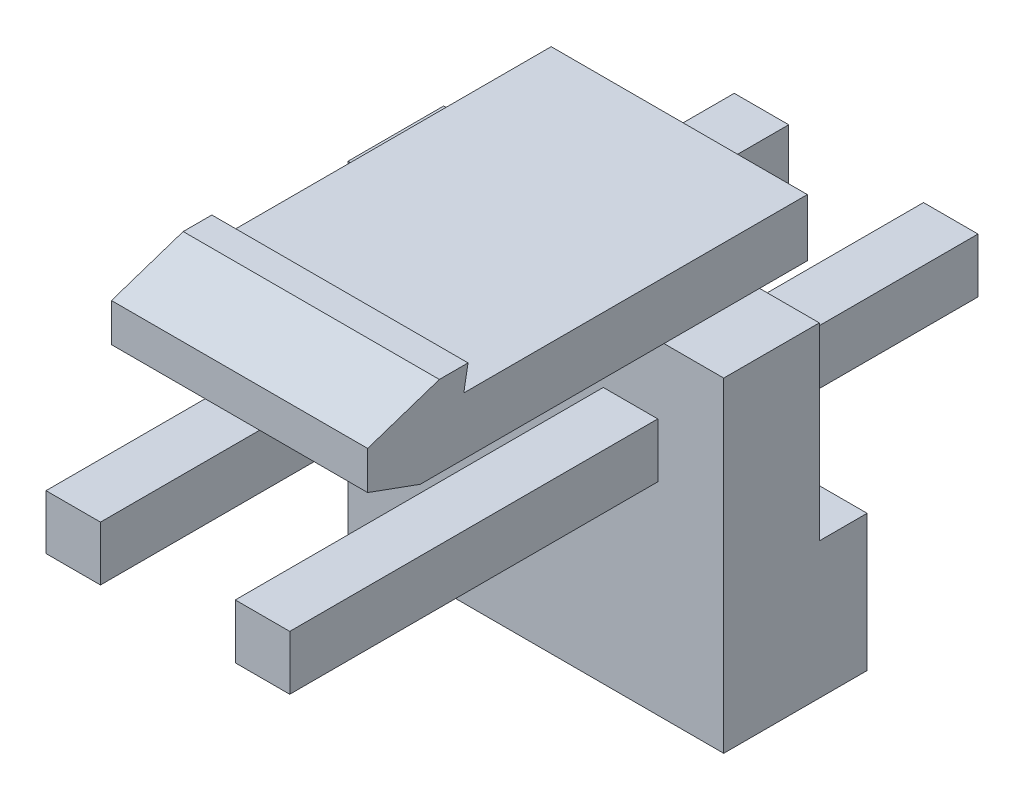
ISO-10303-21;
HEADER;
FILE_DESCRIPTION(('STEP AP214'),'2;1');
FILE_NAME('part.step','',(''),(''),'','','');
FILE_SCHEMA(('AUTOMOTIVE_DESIGN { 1 0 10303 214 1 1 1 1 }'));
ENDSEC;
DATA;
#1=APPLICATION_CONTEXT('core data for automotive mechanical design processes');
#2=APPLICATION_PROTOCOL_DEFINITION('international standard','automotive_design',2000,#1);
#3=PRODUCT_CONTEXT('',#1,'mechanical');
#4=PRODUCT('Part','Part','',(#3));
#5=PRODUCT_RELATED_PRODUCT_CATEGORY('part','',(#4));
#6=PRODUCT_DEFINITION_FORMATION('','',#4);
#7=PRODUCT_DEFINITION_CONTEXT('part definition',#1,'design');
#8=PRODUCT_DEFINITION('design','',#6,#7);
#9=PRODUCT_DEFINITION_SHAPE('','',#8);
#10=(LENGTH_UNIT() NAMED_UNIT(*) SI_UNIT(.MILLI.,.METRE.));
#11=(NAMED_UNIT(*) PLANE_ANGLE_UNIT() SI_UNIT($,.RADIAN.));
#12=(NAMED_UNIT(*) SI_UNIT($,.STERADIAN.) SOLID_ANGLE_UNIT());
#13=UNCERTAINTY_MEASURE_WITH_UNIT(LENGTH_MEASURE(1.E-05),#10,'distance_accuracy_value','');
#14=(GEOMETRIC_REPRESENTATION_CONTEXT(3) GLOBAL_UNCERTAINTY_ASSIGNED_CONTEXT((#13)) GLOBAL_UNIT_ASSIGNED_CONTEXT((#10,
#11,#12)) REPRESENTATION_CONTEXT('',''));
#15=CARTESIAN_POINT('',(0.,0.,0.));
#16=DIRECTION('',(0.,0.,1.));
#17=DIRECTION('',(1.,0.,0.));
#18=AXIS2_PLACEMENT_3D('',#15,#16,#17);
#19=CARTESIAN_POINT('',(-2.68,0.,0.));
#20=DIRECTION('',(1.,0.,0.));
#21=DIRECTION('',(0.,1.,0.));
#22=AXIS2_PLACEMENT_3D('',#19,#20,#21);
#23=PLANE('',#22);
#24=DIRECTION('',(0.,0.,-1.));
#25=VECTOR('',#24,1.);
#26=CARTESIAN_POINT('',(-2.68,2.,5.1));
#27=LINE('',#26,#25);
#28=CARTESIAN_POINT('',(-2.68,2.,5.1));
#29=VERTEX_POINT('',#28);
#30=CARTESIAN_POINT('',(-2.68,2.,0.));
#31=VERTEX_POINT('',#30);
#32=EDGE_CURVE('E403',#29,#31,#27,.T.);
#33=ORIENTED_EDGE('',*,*,#32,.F.);
#34=DIRECTION('',(0.,-0.341743063087106,-0.939793423488291));
#35=VECTOR('',#34,1.);
#36=CARTESIAN_POINT('',(-2.68,2.4,6.2));
#37=LINE('',#36,#35);
#38=CARTESIAN_POINT('',(-2.68,2.4,6.2));
#39=VERTEX_POINT('',#38);
#40=EDGE_CURVE('E42',#39,#29,#37,.T.);
#41=ORIENTED_EDGE('',*,*,#40,.F.);
#42=DIRECTION('',(0.,-1.,0.));
#43=VECTOR('',#42,1.);
#44=CARTESIAN_POINT('',(-2.68,3.2,6.2));
#45=LINE('',#44,#43);
#46=CARTESIAN_POINT('',(-2.68,3.2,6.2));
#47=VERTEX_POINT('',#46);
#48=EDGE_CURVE('E311',#47,#39,#45,.T.);
#49=ORIENTED_EDGE('',*,*,#48,.F.);
#50=DIRECTION('',(0.,-0.316227766016838,0.948683298050514));
#51=VECTOR('',#50,1.);
#52=CARTESIAN_POINT('',(-2.68,3.7,4.7));
#53=LINE('',#52,#51);
#54=CARTESIAN_POINT('',(-2.68,3.7,4.7));
#55=VERTEX_POINT('',#54);
#56=EDGE_CURVE('E299',#55,#47,#53,.T.);
#57=ORIENTED_EDGE('',*,*,#56,.F.);
#58=DIRECTION('',(0.,0.,1.));
#59=VECTOR('',#58,1.);
#60=CARTESIAN_POINT('',(-2.68,3.7,4.1));
#61=LINE('',#60,#59);
#62=CARTESIAN_POINT('',(-2.68,3.7,4.1));
#63=VERTEX_POINT('',#62);
#64=EDGE_CURVE('E549',#63,#55,#61,.T.);
#65=ORIENTED_EDGE('',*,*,#64,.F.);
#66=DIRECTION('',(0.,0.98480775301219,-0.173648177667033));
#67=VECTOR('',#66,1.);
#68=CARTESIAN_POINT('',(-2.68,3.2,4.188163490354));
#69=LINE('',#68,#67);
#70=CARTESIAN_POINT('',(-2.68,3.2,4.188163490354));
#71=VERTEX_POINT('',#70);
#72=EDGE_CURVE('E471',#71,#63,#69,.T.);
#73=ORIENTED_EDGE('',*,*,#72,.F.);
#74=DIRECTION('',(0.,0.,1.));
#75=VECTOR('',#74,1.);
#76=CARTESIAN_POINT('',(-2.68,3.2,-3.));
#77=LINE('',#76,#75);
#78=CARTESIAN_POINT('',(-2.68,3.2,-3.));
#79=VERTEX_POINT('',#78);
#80=EDGE_CURVE('E472',#79,#71,#77,.T.);
#81=ORIENTED_EDGE('',*,*,#80,.F.);
#82=DIRECTION('',(0.,1.,0.));
#83=VECTOR('',#82,1.);
#84=CARTESIAN_POINT('',(-2.68,2.,-3.));
#85=LINE('',#84,#83);
#86=CARTESIAN_POINT('',(-2.68,2.,-3.));
#87=VERTEX_POINT('',#86);
#88=EDGE_CURVE('E341',#87,#79,#85,.T.);
#89=ORIENTED_EDGE('',*,*,#88,.F.);
#90=DIRECTION('',(0.,0.,-1.));
#91=VECTOR('',#90,1.);
#92=CARTESIAN_POINT('',(-2.68,2.,-2.));
#93=LINE('',#92,#91);
#94=CARTESIAN_POINT('',(-2.68,2.,-2.));
#95=VERTEX_POINT('',#94);
#96=EDGE_CURVE('E404',#95,#87,#93,.T.);
#97=ORIENTED_EDGE('',*,*,#96,.F.);
#98=DIRECTION('',(0.,0.,1.));
#99=VECTOR('',#98,1.);
#100=CARTESIAN_POINT('',(-2.68,2.,-2.));
#101=LINE('',#100,#99);
#102=EDGE_CURVE('E11',#95,#31,#101,.T.);
#103=ORIENTED_EDGE('',*,*,#102,.T.);
#104=EDGE_LOOP('',(#33,#41,#49,#57,#65,#73,#81,#89,#97,#103));
#105=FACE_BOUND('',#104,.T.);
#106=ADVANCED_FACE('F17',(#105),#23,.F.);
#107=CARTESIAN_POINT('',(-3.93,2.,-2.));
#108=DIRECTION('',(0.,1.,0.));
#109=DIRECTION('',(1.,0.,0.));
#110=AXIS2_PLACEMENT_3D('',#107,#108,#109);
#111=PLANE('',#110);
#112=DIRECTION('',(1.,0.,0.));
#113=VECTOR('',#112,1.);
#114=CARTESIAN_POINT('',(-3.93,2.,-2.));
#115=LINE('',#114,#113);
#116=CARTESIAN_POINT('',(-3.93,2.,-2.));
#117=VERTEX_POINT('',#116);
#118=EDGE_CURVE('E473',#117,#95,#115,.T.);
#119=ORIENTED_EDGE('',*,*,#118,.F.);
#120=DIRECTION('',(0.,0.,1.));
#121=VECTOR('',#120,1.);
#122=CARTESIAN_POINT('',(-3.93,2.,-2.));
#123=LINE('',#122,#121);
#124=CARTESIAN_POINT('',(-3.93,2.,0.));
#125=VERTEX_POINT('',#124);
#126=EDGE_CURVE('E28',#117,#125,#123,.T.);
#127=ORIENTED_EDGE('',*,*,#126,.T.);
#128=DIRECTION('',(1.,0.,0.));
#129=VECTOR('',#128,1.);
#130=CARTESIAN_POINT('',(-3.93,2.,0.));
#131=LINE('',#130,#129);
#132=EDGE_CURVE('E432',#125,#31,#131,.T.);
#133=ORIENTED_EDGE('',*,*,#132,.T.);
#134=ORIENTED_EDGE('',*,*,#102,.F.);
#135=EDGE_LOOP('',(#119,#127,#133,#134));
#136=FACE_BOUND('',#135,.T.);
#137=ADVANCED_FACE('F19',(#136),#111,.T.);
#138=CARTESIAN_POINT('',(-3.93,2.,-2.));
#139=DIRECTION('',(0.,1.,0.));
#140=DIRECTION('',(1.,0.,0.));
#141=AXIS2_PLACEMENT_3D('',#138,#139,#140);
#142=PLANE('',#141);
#143=DIRECTION('',(1.,0.,0.));
#144=VECTOR('',#143,1.);
#145=CARTESIAN_POINT('',(2.68,2.,0.));
#146=LINE('',#145,#144);
#147=CARTESIAN_POINT('',(2.68,2.,0.));
#148=VERTEX_POINT('',#147);
#149=CARTESIAN_POINT('',(3.93,2.,0.));
#150=VERTEX_POINT('',#149);
#151=EDGE_CURVE('E436',#148,#150,#146,.T.);
#152=ORIENTED_EDGE('',*,*,#151,.T.);
#153=DIRECTION('',(0.,0.,1.));
#154=VECTOR('',#153,1.);
#155=CARTESIAN_POINT('',(3.93,2.,-2.));
#156=LINE('',#155,#154);
#157=CARTESIAN_POINT('',(3.93,2.,-2.));
#158=VERTEX_POINT('',#157);
#159=EDGE_CURVE('E440',#158,#150,#156,.T.);
#160=ORIENTED_EDGE('',*,*,#159,.F.);
#161=DIRECTION('',(1.,0.,0.));
#162=VECTOR('',#161,1.);
#163=CARTESIAN_POINT('',(2.68,2.,-2.));
#164=LINE('',#163,#162);
#165=CARTESIAN_POINT('',(2.68,2.,-2.));
#166=VERTEX_POINT('',#165);
#167=EDGE_CURVE('E413',#166,#158,#164,.T.);
#168=ORIENTED_EDGE('',*,*,#167,.F.);
#169=DIRECTION('',(0.,0.,1.));
#170=VECTOR('',#169,1.);
#171=CARTESIAN_POINT('',(2.68,2.,-2.));
#172=LINE('',#171,#170);
#173=EDGE_CURVE('E519',#166,#148,#172,.T.);
#174=ORIENTED_EDGE('',*,*,#173,.T.);
#175=EDGE_LOOP('',(#152,#160,#168,#174));
#176=FACE_BOUND('',#175,.T.);
#177=ADVANCED_FACE('F699',(#176),#142,.T.);
#178=CARTESIAN_POINT('',(-3.93,2.,0.));
#179=DIRECTION('',(0.,0.,1.));
#180=DIRECTION('',(1.,0.,0.));
#181=AXIS2_PLACEMENT_3D('',#178,#179,#180);
#182=PLANE('',#181);
#183=ORIENTED_EDGE('',*,*,#132,.F.);
#184=DIRECTION('',(0.,-1.,0.));
#185=VECTOR('',#184,1.);
#186=CARTESIAN_POINT('',(-3.93,2.,0.));
#187=LINE('',#186,#185);
#188=CARTESIAN_POINT('',(-3.93,-4.8,0.));
#189=VERTEX_POINT('',#188);
#190=EDGE_CURVE('E558',#125,#189,#187,.T.);
#191=ORIENTED_EDGE('',*,*,#190,.T.);
#192=DIRECTION('',(1.,0.,0.));
#193=VECTOR('',#192,1.);
#194=CARTESIAN_POINT('',(-3.93,-4.8,0.));
#195=LINE('',#194,#193);
#196=CARTESIAN_POINT('',(3.93,-4.8,0.));
#197=VERTEX_POINT('',#196);
#198=EDGE_CURVE('E562',#189,#197,#195,.T.);
#199=ORIENTED_EDGE('',*,*,#198,.T.);
#200=DIRECTION('',(0.,-1.,0.));
#201=VECTOR('',#200,1.);
#202=CARTESIAN_POINT('',(3.93,2.,0.));
#203=LINE('',#202,#201);
#204=EDGE_CURVE('E427',#150,#197,#203,.T.);
#205=ORIENTED_EDGE('',*,*,#204,.F.);
#206=ORIENTED_EDGE('',*,*,#151,.F.);
#207=DIRECTION('',(1.,0.,0.));
#208=VECTOR('',#207,1.);
#209=CARTESIAN_POINT('',(-2.68,2.,0.));
#210=LINE('',#209,#208);
#211=EDGE_CURVE('E400',#31,#148,#210,.T.);
#212=ORIENTED_EDGE('',*,*,#211,.F.);
#213=EDGE_LOOP('',(#183,#191,#199,#205,#206,#212));
#214=FACE_BOUND('',#213,.T.);
#215=DIRECTION('',(-1.,0.,0.));
#216=VECTOR('',#215,1.);
#217=CARTESIAN_POINT('',(-1.41,-0.57,0.));
#218=LINE('',#217,#216);
#219=CARTESIAN_POINT('',(-1.41,-0.57,0.));
#220=VERTEX_POINT('',#219);
#221=CARTESIAN_POINT('',(-2.55,-0.57,0.));
#222=VERTEX_POINT('',#221);
#223=EDGE_CURVE('E581',#220,#222,#218,.T.);
#224=ORIENTED_EDGE('',*,*,#223,.T.);
#225=DIRECTION('',(0.,-1.,0.));
#226=VECTOR('',#225,1.);
#227=CARTESIAN_POINT('',(-2.55,0.57,0.));
#228=LINE('',#227,#226);
#229=CARTESIAN_POINT('',(-2.55,0.57,0.));
#230=VERTEX_POINT('',#229);
#231=EDGE_CURVE('E534',#230,#222,#228,.T.);
#232=ORIENTED_EDGE('',*,*,#231,.F.);
#233=DIRECTION('',(-1.,0.,0.));
#234=VECTOR('',#233,1.);
#235=CARTESIAN_POINT('',(-1.41,0.57,0.));
#236=LINE('',#235,#234);
#237=CARTESIAN_POINT('',(-1.41,0.57,0.));
#238=VERTEX_POINT('',#237);
#239=EDGE_CURVE('E396',#238,#230,#236,.T.);
#240=ORIENTED_EDGE('',*,*,#239,.F.);
#241=DIRECTION('',(0.,-1.,0.));
#242=VECTOR('',#241,1.);
#243=CARTESIAN_POINT('',(-1.41,0.57,0.));
#244=LINE('',#243,#242);
#245=EDGE_CURVE('E585',#238,#220,#244,.T.);
#246=ORIENTED_EDGE('',*,*,#245,.T.);
#247=EDGE_LOOP('',(#224,#232,#240,#246));
#248=FACE_BOUND('',#247,.T.);
#249=DIRECTION('',(-1.,0.,0.));
#250=VECTOR('',#249,1.);
#251=CARTESIAN_POINT('',(2.55,-0.57,0.));
#252=LINE('',#251,#250);
#253=CARTESIAN_POINT('',(2.55,-0.57,0.));
#254=VERTEX_POINT('',#253);
#255=CARTESIAN_POINT('',(1.41,-0.57,0.));
#256=VERTEX_POINT('',#255);
#257=EDGE_CURVE('E619',#254,#256,#252,.T.);
#258=ORIENTED_EDGE('',*,*,#257,.T.);
#259=DIRECTION('',(0.,-1.,0.));
#260=VECTOR('',#259,1.);
#261=CARTESIAN_POINT('',(1.41,0.57,0.));
#262=LINE('',#261,#260);
#263=CARTESIAN_POINT('',(1.41,0.57,0.));
#264=VERTEX_POINT('',#263);
#265=EDGE_CURVE('E463',#264,#256,#262,.T.);
#266=ORIENTED_EDGE('',*,*,#265,.F.);
#267=DIRECTION('',(-1.,0.,0.));
#268=VECTOR('',#267,1.);
#269=CARTESIAN_POINT('',(2.55,0.57,0.));
#270=LINE('',#269,#268);
#271=CARTESIAN_POINT('',(2.55,0.57,0.));
#272=VERTEX_POINT('',#271);
#273=EDGE_CURVE('E464',#272,#264,#270,.T.);
#274=ORIENTED_EDGE('',*,*,#273,.F.);
#275=DIRECTION('',(0.,-1.,0.));
#276=VECTOR('',#275,1.);
#277=CARTESIAN_POINT('',(2.55,0.57,0.));
#278=LINE('',#277,#276);
#279=EDGE_CURVE('E610',#272,#254,#278,.T.);
#280=ORIENTED_EDGE('',*,*,#279,.T.);
#281=EDGE_LOOP('',(#258,#266,#274,#280));
#282=FACE_BOUND('',#281,.T.);
#283=ADVANCED_FACE('F664',(#214,#248,#282),#182,.T.);
#284=CARTESIAN_POINT('',(-2.68,2.,5.1));
#285=DIRECTION('',(0.,-1.,0.));
#286=DIRECTION('',(0.,0.,-1.));
#287=AXIS2_PLACEMENT_3D('',#284,#285,#286);
#288=PLANE('',#287);
#289=DIRECTION('',(0.,0.,-1.));
#290=VECTOR('',#289,1.);
#291=CARTESIAN_POINT('',(2.68,2.,5.1));
#292=LINE('',#291,#290);
#293=CARTESIAN_POINT('',(2.68,2.,5.1));
#294=VERTEX_POINT('',#293);
#295=EDGE_CURVE('E209',#294,#148,#292,.T.);
#296=ORIENTED_EDGE('',*,*,#295,.F.);
#297=DIRECTION('',(1.,0.,0.));
#298=VECTOR('',#297,1.);
#299=CARTESIAN_POINT('',(-2.68,2.,5.1));
#300=LINE('',#299,#298);
#301=EDGE_CURVE('E378',#29,#294,#300,.T.);
#302=ORIENTED_EDGE('',*,*,#301,.F.);
#303=ORIENTED_EDGE('',*,*,#32,.T.);
#304=ORIENTED_EDGE('',*,*,#211,.T.);
#305=EDGE_LOOP('',(#296,#302,#303,#304));
#306=FACE_BOUND('',#305,.T.);
#307=ADVANCED_FACE('F716',(#306),#288,.T.);
#308=CARTESIAN_POINT('',(-2.68,2.,5.1));
#309=DIRECTION('',(0.,-1.,0.));
#310=DIRECTION('',(0.,0.,-1.));
#311=AXIS2_PLACEMENT_3D('',#308,#309,#310);
#312=PLANE('',#311);
#313=ORIENTED_EDGE('',*,*,#96,.T.);
#314=DIRECTION('',(1.,0.,0.));
#315=VECTOR('',#314,1.);
#316=CARTESIAN_POINT('',(-2.68,2.,-3.));
#317=LINE('',#316,#315);
#318=CARTESIAN_POINT('',(2.68,2.,-3.));
#319=VERTEX_POINT('',#318);
#320=EDGE_CURVE('E451',#87,#319,#317,.T.);
#321=ORIENTED_EDGE('',*,*,#320,.T.);
#322=DIRECTION('',(0.,0.,-1.));
#323=VECTOR('',#322,1.);
#324=CARTESIAN_POINT('',(2.68,2.,-2.));
#325=LINE('',#324,#323);
#326=EDGE_CURVE('E220',#166,#319,#325,.T.);
#327=ORIENTED_EDGE('',*,*,#326,.F.);
#328=DIRECTION('',(1.,0.,0.));
#329=VECTOR('',#328,1.);
#330=CARTESIAN_POINT('',(-2.68,2.,-2.));
#331=LINE('',#330,#329);
#332=EDGE_CURVE('E375',#95,#166,#331,.T.);
#333=ORIENTED_EDGE('',*,*,#332,.F.);
#334=EDGE_LOOP('',(#313,#321,#327,#333));
#335=FACE_BOUND('',#334,.T.);
#336=ADVANCED_FACE('F490',(#335),#312,.T.);
#337=CARTESIAN_POINT('',(-2.68,2.4,6.2));
#338=DIRECTION('',(0.,-0.939793423488291,0.341743063087106));
#339=DIRECTION('',(-1.,0.,0.));
#340=AXIS2_PLACEMENT_3D('',#337,#338,#339);
#341=PLANE('',#340);
#342=ORIENTED_EDGE('',*,*,#301,.T.);
#343=DIRECTION('',(0.,-0.341743063087106,-0.939793423488291));
#344=VECTOR('',#343,1.);
#345=CARTESIAN_POINT('',(2.68,2.4,6.2));
#346=LINE('',#345,#344);
#347=CARTESIAN_POINT('',(2.68,2.4,6.2));
#348=VERTEX_POINT('',#347);
#349=EDGE_CURVE('E476',#348,#294,#346,.T.);
#350=ORIENTED_EDGE('',*,*,#349,.F.);
#351=DIRECTION('',(1.,0.,0.));
#352=VECTOR('',#351,1.);
#353=CARTESIAN_POINT('',(-2.68,2.4,6.2));
#354=LINE('',#353,#352);
#355=EDGE_CURVE('E315',#39,#348,#354,.T.);
#356=ORIENTED_EDGE('',*,*,#355,.F.);
#357=ORIENTED_EDGE('',*,*,#40,.T.);
#358=EDGE_LOOP('',(#342,#350,#356,#357));
#359=FACE_BOUND('',#358,.T.);
#360=ADVANCED_FACE('F713',(#359),#341,.T.);
#361=CARTESIAN_POINT('',(-2.68,3.2,6.2));
#362=DIRECTION('',(0.,0.,1.));
#363=DIRECTION('',(1.,0.,0.));
#364=AXIS2_PLACEMENT_3D('',#361,#362,#363);
#365=PLANE('',#364);
#366=ORIENTED_EDGE('',*,*,#355,.T.);
#367=DIRECTION('',(0.,-1.,0.));
#368=VECTOR('',#367,1.);
#369=CARTESIAN_POINT('',(2.68,3.2,6.2));
#370=LINE('',#369,#368);
#371=CARTESIAN_POINT('',(2.68,3.2,6.2));
#372=VERTEX_POINT('',#371);
#373=EDGE_CURVE('E319',#372,#348,#370,.T.);
#374=ORIENTED_EDGE('',*,*,#373,.F.);
#375=DIRECTION('',(1.,0.,0.));
#376=VECTOR('',#375,1.);
#377=CARTESIAN_POINT('',(-2.68,3.2,6.2));
#378=LINE('',#377,#376);
#379=EDGE_CURVE('E303',#47,#372,#378,.T.);
#380=ORIENTED_EDGE('',*,*,#379,.F.);
#381=ORIENTED_EDGE('',*,*,#48,.T.);
#382=EDGE_LOOP('',(#366,#374,#380,#381));
#383=FACE_BOUND('',#382,.T.);
#384=ADVANCED_FACE('F317',(#383),#365,.T.);
#385=CARTESIAN_POINT('',(-2.68,3.7,4.7));
#386=DIRECTION('',(0.,0.948683298050514,0.316227766016838));
#387=DIRECTION('',(1.,0.,0.));
#388=AXIS2_PLACEMENT_3D('',#385,#386,#387);
#389=PLANE('',#388);
#390=ORIENTED_EDGE('',*,*,#379,.T.);
#391=DIRECTION('',(0.,-0.316227766016838,0.948683298050514));
#392=VECTOR('',#391,1.);
#393=CARTESIAN_POINT('',(2.68,3.7,4.7));
#394=LINE('',#393,#392);
#395=CARTESIAN_POINT('',(2.68,3.7,4.7));
#396=VERTEX_POINT('',#395);
#397=EDGE_CURVE('E410',#396,#372,#394,.T.);
#398=ORIENTED_EDGE('',*,*,#397,.F.);
#399=DIRECTION('',(1.,0.,0.));
#400=VECTOR('',#399,1.);
#401=CARTESIAN_POINT('',(-2.68,3.7,4.7));
#402=LINE('',#401,#400);
#403=EDGE_CURVE('E306',#55,#396,#402,.T.);
#404=ORIENTED_EDGE('',*,*,#403,.F.);
#405=ORIENTED_EDGE('',*,*,#56,.T.);
#406=EDGE_LOOP('',(#390,#398,#404,#405));
#407=FACE_BOUND('',#406,.T.);
#408=ADVANCED_FACE('F301',(#407),#389,.T.);
#409=CARTESIAN_POINT('',(-2.68,3.7,4.1));
#410=DIRECTION('',(0.,1.,0.));
#411=DIRECTION('',(1.,0.,0.));
#412=AXIS2_PLACEMENT_3D('',#409,#410,#411);
#413=PLANE('',#412);
#414=ORIENTED_EDGE('',*,*,#403,.T.);
#415=DIRECTION('',(0.,0.,1.));
#416=VECTOR('',#415,1.);
#417=CARTESIAN_POINT('',(2.68,3.7,4.1));
#418=LINE('',#417,#416);
#419=CARTESIAN_POINT('',(2.68,3.7,4.1));
#420=VERTEX_POINT('',#419);
#421=EDGE_CURVE('E21',#420,#396,#418,.T.);
#422=ORIENTED_EDGE('',*,*,#421,.F.);
#423=DIRECTION('',(1.,0.,0.));
#424=VECTOR('',#423,1.);
#425=CARTESIAN_POINT('',(-2.68,3.7,4.1));
#426=LINE('',#425,#424);
#427=EDGE_CURVE('E592',#63,#420,#426,.T.);
#428=ORIENTED_EDGE('',*,*,#427,.F.);
#429=ORIENTED_EDGE('',*,*,#64,.T.);
#430=EDGE_LOOP('',(#414,#422,#428,#429));
#431=FACE_BOUND('',#430,.T.);
#432=ADVANCED_FACE('F731',(#431),#413,.T.);
#433=CARTESIAN_POINT('',(-2.68,3.2,4.188163490354));
#434=DIRECTION('',(0.,-0.173648177667033,-0.98480775301219));
#435=DIRECTION('',(0.,-0.98480775301219,0.173648177667033));
#436=AXIS2_PLACEMENT_3D('',#433,#434,#435);
#437=PLANE('',#436);
#438=ORIENTED_EDGE('',*,*,#427,.T.);
#439=DIRECTION('',(0.,0.98480775301219,-0.173648177667033));
#440=VECTOR('',#439,1.);
#441=CARTESIAN_POINT('',(2.68,3.2,4.188163490354));
#442=LINE('',#441,#440);
#443=CARTESIAN_POINT('',(2.68,3.2,4.188163490354));
#444=VERTEX_POINT('',#443);
#445=EDGE_CURVE('E422',#444,#420,#442,.T.);
#446=ORIENTED_EDGE('',*,*,#445,.F.);
#447=DIRECTION('',(1.,0.,0.));
#448=VECTOR('',#447,1.);
#449=CARTESIAN_POINT('',(-2.68,3.2,4.188163490354));
#450=LINE('',#449,#448);
#451=EDGE_CURVE('E467',#71,#444,#450,.T.);
#452=ORIENTED_EDGE('',*,*,#451,.F.);
#453=ORIENTED_EDGE('',*,*,#72,.T.);
#454=EDGE_LOOP('',(#438,#446,#452,#453));
#455=FACE_BOUND('',#454,.T.);
#456=ADVANCED_FACE('F734',(#455),#437,.T.);
#457=CARTESIAN_POINT('',(-2.68,3.2,-3.));
#458=DIRECTION('',(0.,1.,0.));
#459=DIRECTION('',(1.,0.,0.));
#460=AXIS2_PLACEMENT_3D('',#457,#458,#459);
#461=PLANE('',#460);
#462=ORIENTED_EDGE('',*,*,#451,.T.);
#463=DIRECTION('',(0.,0.,1.));
#464=VECTOR('',#463,1.);
#465=CARTESIAN_POINT('',(2.68,3.2,-3.));
#466=LINE('',#465,#464);
#467=CARTESIAN_POINT('',(2.68,3.2,-3.));
#468=VERTEX_POINT('',#467);
#469=EDGE_CURVE('E426',#468,#444,#466,.T.);
#470=ORIENTED_EDGE('',*,*,#469,.F.);
#471=DIRECTION('',(1.,0.,0.));
#472=VECTOR('',#471,1.);
#473=CARTESIAN_POINT('',(-2.68,3.2,-3.));
#474=LINE('',#473,#472);
#475=EDGE_CURVE('E499',#79,#468,#474,.T.);
#476=ORIENTED_EDGE('',*,*,#475,.F.);
#477=ORIENTED_EDGE('',*,*,#80,.T.);
#478=EDGE_LOOP('',(#462,#470,#476,#477));
#479=FACE_BOUND('',#478,.T.);
#480=ADVANCED_FACE('F752',(#479),#461,.T.);
#481=CARTESIAN_POINT('',(-2.68,2.,-3.));
#482=DIRECTION('',(0.,0.,-1.));
#483=DIRECTION('',(0.,-1.,0.));
#484=AXIS2_PLACEMENT_3D('',#481,#482,#483);
#485=PLANE('',#484);
#486=ORIENTED_EDGE('',*,*,#475,.T.);
#487=DIRECTION('',(0.,1.,0.));
#488=VECTOR('',#487,1.);
#489=CARTESIAN_POINT('',(2.68,2.,-3.));
#490=LINE('',#489,#488);
#491=EDGE_CURVE('E342',#319,#468,#490,.T.);
#492=ORIENTED_EDGE('',*,*,#491,.F.);
#493=ORIENTED_EDGE('',*,*,#320,.F.);
#494=ORIENTED_EDGE('',*,*,#88,.T.);
#495=EDGE_LOOP('',(#486,#492,#493,#494));
#496=FACE_BOUND('',#495,.T.);
#497=ADVANCED_FACE('F496',(#496),#485,.T.);
#498=CARTESIAN_POINT('',(2.68,0.,0.));
#499=DIRECTION('',(1.,0.,0.));
#500=DIRECTION('',(0.,1.,0.));
#501=AXIS2_PLACEMENT_3D('',#498,#499,#500);
#502=PLANE('',#501);
#503=ORIENTED_EDGE('',*,*,#326,.T.);
#504=ORIENTED_EDGE('',*,*,#491,.T.);
#505=ORIENTED_EDGE('',*,*,#469,.T.);
#506=ORIENTED_EDGE('',*,*,#445,.T.);
#507=ORIENTED_EDGE('',*,*,#421,.T.);
#508=ORIENTED_EDGE('',*,*,#397,.T.);
#509=ORIENTED_EDGE('',*,*,#373,.T.);
#510=ORIENTED_EDGE('',*,*,#349,.T.);
#511=ORIENTED_EDGE('',*,*,#295,.T.);
#512=ORIENTED_EDGE('',*,*,#173,.F.);
#513=EDGE_LOOP('',(#503,#504,#505,#506,#507,#508,#509,#510,#511,#512));
#514=FACE_BOUND('',#513,.T.);
#515=ADVANCED_FACE('F723',(#514),#502,.T.);
#516=CARTESIAN_POINT('',(-3.93,-1.95,-2.));
#517=DIRECTION('',(0.,0.,-1.));
#518=DIRECTION('',(0.,-1.,0.));
#519=AXIS2_PLACEMENT_3D('',#516,#517,#518);
#520=PLANE('',#519);
#521=ORIENTED_EDGE('',*,*,#167,.T.);
#522=DIRECTION('',(0.,1.,0.));
#523=VECTOR('',#522,1.);
#524=CARTESIAN_POINT('',(3.93,-1.95,-2.));
#525=LINE('',#524,#523);
#526=CARTESIAN_POINT('',(3.93,-1.95,-2.));
#527=VERTEX_POINT('',#526);
#528=EDGE_CURVE('E447',#527,#158,#525,.T.);
#529=ORIENTED_EDGE('',*,*,#528,.F.);
#530=DIRECTION('',(1.,0.,0.));
#531=VECTOR('',#530,1.);
#532=CARTESIAN_POINT('',(-3.93,-1.95,-2.));
#533=LINE('',#532,#531);
#534=CARTESIAN_POINT('',(-3.93,-1.95,-2.));
#535=VERTEX_POINT('',#534);
#536=EDGE_CURVE('E437',#535,#527,#533,.T.);
#537=ORIENTED_EDGE('',*,*,#536,.F.);
#538=DIRECTION('',(0.,1.,0.));
#539=VECTOR('',#538,1.);
#540=CARTESIAN_POINT('',(-3.93,-1.95,-2.));
#541=LINE('',#540,#539);
#542=EDGE_CURVE('E417',#535,#117,#541,.T.);
#543=ORIENTED_EDGE('',*,*,#542,.T.);
#544=ORIENTED_EDGE('',*,*,#118,.T.);
#545=ORIENTED_EDGE('',*,*,#332,.T.);
#546=EDGE_LOOP('',(#521,#529,#537,#543,#544,#545));
#547=FACE_BOUND('',#546,.T.);
#548=DIRECTION('',(-1.,0.,0.));
#549=VECTOR('',#548,1.);
#550=CARTESIAN_POINT('',(-1.41,0.57,-2.));
#551=LINE('',#550,#549);
#552=CARTESIAN_POINT('',(-1.41,0.57,-2.));
#553=VERTEX_POINT('',#552);
#554=CARTESIAN_POINT('',(-2.55,0.57,-2.));
#555=VERTEX_POINT('',#554);
#556=EDGE_CURVE('E371',#553,#555,#551,.T.);
#557=ORIENTED_EDGE('',*,*,#556,.T.);
#558=DIRECTION('',(0.,-1.,0.));
#559=VECTOR('',#558,1.);
#560=CARTESIAN_POINT('',(-2.55,0.57,-2.));
#561=LINE('',#560,#559);
#562=CARTESIAN_POINT('',(-2.55,-0.57,-2.));
#563=VERTEX_POINT('',#562);
#564=EDGE_CURVE('E327',#555,#563,#561,.T.);
#565=ORIENTED_EDGE('',*,*,#564,.T.);
#566=DIRECTION('',(-1.,0.,0.));
#567=VECTOR('',#566,1.);
#568=CARTESIAN_POINT('',(-1.41,-0.57,-2.));
#569=LINE('',#568,#567);
#570=CARTESIAN_POINT('',(-1.41,-0.57,-2.));
#571=VERTEX_POINT('',#570);
#572=EDGE_CURVE('E418',#571,#563,#569,.T.);
#573=ORIENTED_EDGE('',*,*,#572,.F.);
#574=DIRECTION('',(0.,-1.,0.));
#575=VECTOR('',#574,1.);
#576=CARTESIAN_POINT('',(-1.41,0.57,-2.));
#577=LINE('',#576,#575);
#578=EDGE_CURVE('E409',#553,#571,#577,.T.);
#579=ORIENTED_EDGE('',*,*,#578,.F.);
#580=EDGE_LOOP('',(#557,#565,#573,#579));
#581=FACE_BOUND('',#580,.T.);
#582=DIRECTION('',(-1.,0.,0.));
#583=VECTOR('',#582,1.);
#584=CARTESIAN_POINT('',(2.55,0.57,-2.));
#585=LINE('',#584,#583);
#586=CARTESIAN_POINT('',(2.55,0.57,-2.));
#587=VERTEX_POINT('',#586);
#588=CARTESIAN_POINT('',(1.41,0.57,-2.));
#589=VERTEX_POINT('',#588);
#590=EDGE_CURVE('E529',#587,#589,#585,.T.);
#591=ORIENTED_EDGE('',*,*,#590,.T.);
#592=DIRECTION('',(0.,-1.,0.));
#593=VECTOR('',#592,1.);
#594=CARTESIAN_POINT('',(1.41,0.57,-2.));
#595=LINE('',#594,#593);
#596=CARTESIAN_POINT('',(1.41,-0.57,-2.));
#597=VERTEX_POINT('',#596);
#598=EDGE_CURVE('E369',#589,#597,#595,.T.);
#599=ORIENTED_EDGE('',*,*,#598,.T.);
#600=DIRECTION('',(-1.,0.,0.));
#601=VECTOR('',#600,1.);
#602=CARTESIAN_POINT('',(2.55,-0.57,-2.));
#603=LINE('',#602,#601);
#604=CARTESIAN_POINT('',(2.55,-0.57,-2.));
#605=VERTEX_POINT('',#604);
#606=EDGE_CURVE('E347',#605,#597,#603,.T.);
#607=ORIENTED_EDGE('',*,*,#606,.F.);
#608=DIRECTION('',(0.,-1.,0.));
#609=VECTOR('',#608,1.);
#610=CARTESIAN_POINT('',(2.55,0.57,-2.));
#611=LINE('',#610,#609);
#612=EDGE_CURVE('E383',#587,#605,#611,.T.);
#613=ORIENTED_EDGE('',*,*,#612,.F.);
#614=EDGE_LOOP('',(#591,#599,#607,#613));
#615=FACE_BOUND('',#614,.T.);
#616=ADVANCED_FACE('F719',(#547,#581,#615),#520,.T.);
#617=CARTESIAN_POINT('',(-3.93,0.,0.));
#618=DIRECTION('',(1.,0.,0.));
#619=DIRECTION('',(0.,1.,0.));
#620=AXIS2_PLACEMENT_3D('',#617,#618,#619);
#621=PLANE('',#620);
#622=ORIENTED_EDGE('',*,*,#542,.F.);
#623=DIRECTION('',(0.,0.,1.));
#624=VECTOR('',#623,1.);
#625=CARTESIAN_POINT('',(-3.93,-1.95,-3.));
#626=LINE('',#625,#624);
#627=CARTESIAN_POINT('',(-3.93,-1.95,-3.));
#628=VERTEX_POINT('',#627);
#629=EDGE_CURVE('E441',#628,#535,#626,.T.);
#630=ORIENTED_EDGE('',*,*,#629,.F.);
#631=DIRECTION('',(0.,1.,0.));
#632=VECTOR('',#631,1.);
#633=CARTESIAN_POINT('',(-3.93,-4.8,-3.));
#634=LINE('',#633,#632);
#635=CARTESIAN_POINT('',(-3.93,-4.8,-3.));
#636=VERTEX_POINT('',#635);
#637=EDGE_CURVE('E405',#636,#628,#634,.T.);
#638=ORIENTED_EDGE('',*,*,#637,.F.);
#639=DIRECTION('',(0.,0.,-1.));
#640=VECTOR('',#639,1.);
#641=CARTESIAN_POINT('',(-3.93,-4.8,0.));
#642=LINE('',#641,#640);
#643=EDGE_CURVE('E370',#189,#636,#642,.T.);
#644=ORIENTED_EDGE('',*,*,#643,.F.);
#645=ORIENTED_EDGE('',*,*,#190,.F.);
#646=ORIENTED_EDGE('',*,*,#126,.F.);
#647=EDGE_LOOP('',(#622,#630,#638,#644,#645,#646));
#648=FACE_BOUND('',#647,.T.);
#649=ADVANCED_FACE('F722',(#648),#621,.F.);
#650=CARTESIAN_POINT('',(-3.93,-4.8,0.));
#651=DIRECTION('',(0.,-1.,0.));
#652=DIRECTION('',(0.,0.,-1.));
#653=AXIS2_PLACEMENT_3D('',#650,#651,#652);
#654=PLANE('',#653);
#655=DIRECTION('',(1.,0.,0.));
#656=VECTOR('',#655,1.);
#657=CARTESIAN_POINT('',(-3.93,-4.8,-3.));
#658=LINE('',#657,#656);
#659=CARTESIAN_POINT('',(3.93,-4.8,-3.));
#660=VERTEX_POINT('',#659);
#661=EDGE_CURVE('E365',#636,#660,#658,.T.);
#662=ORIENTED_EDGE('',*,*,#661,.T.);
#663=DIRECTION('',(0.,0.,-1.));
#664=VECTOR('',#663,1.);
#665=CARTESIAN_POINT('',(3.93,-4.8,0.));
#666=LINE('',#665,#664);
#667=EDGE_CURVE('E431',#197,#660,#666,.T.);
#668=ORIENTED_EDGE('',*,*,#667,.F.);
#669=ORIENTED_EDGE('',*,*,#198,.F.);
#670=ORIENTED_EDGE('',*,*,#643,.T.);
#671=EDGE_LOOP('',(#662,#668,#669,#670));
#672=FACE_BOUND('',#671,.T.);
#673=ADVANCED_FACE('F736',(#672),#654,.T.);
#674=CARTESIAN_POINT('',(3.93,0.,0.));
#675=DIRECTION('',(1.,0.,0.));
#676=DIRECTION('',(0.,1.,0.));
#677=AXIS2_PLACEMENT_3D('',#674,#675,#676);
#678=PLANE('',#677);
#679=ORIENTED_EDGE('',*,*,#204,.T.);
#680=ORIENTED_EDGE('',*,*,#667,.T.);
#681=DIRECTION('',(0.,1.,0.));
#682=VECTOR('',#681,1.);
#683=CARTESIAN_POINT('',(3.93,-4.8,-3.));
#684=LINE('',#683,#682);
#685=CARTESIAN_POINT('',(3.93,-1.95,-3.));
#686=VERTEX_POINT('',#685);
#687=EDGE_CURVE('E446',#660,#686,#684,.T.);
#688=ORIENTED_EDGE('',*,*,#687,.T.);
#689=DIRECTION('',(0.,0.,1.));
#690=VECTOR('',#689,1.);
#691=CARTESIAN_POINT('',(3.93,-1.95,-3.));
#692=LINE('',#691,#690);
#693=EDGE_CURVE('E442',#686,#527,#692,.T.);
#694=ORIENTED_EDGE('',*,*,#693,.T.);
#695=ORIENTED_EDGE('',*,*,#528,.T.);
#696=ORIENTED_EDGE('',*,*,#159,.T.);
#697=EDGE_LOOP('',(#679,#680,#688,#694,#695,#696));
#698=FACE_BOUND('',#697,.T.);
#699=ADVANCED_FACE('F739',(#698),#678,.T.);
#700=CARTESIAN_POINT('',(-3.93,-1.95,-3.));
#701=DIRECTION('',(0.,1.,0.));
#702=DIRECTION('',(1.,0.,0.));
#703=AXIS2_PLACEMENT_3D('',#700,#701,#702);
#704=PLANE('',#703);
#705=ORIENTED_EDGE('',*,*,#536,.T.);
#706=ORIENTED_EDGE('',*,*,#693,.F.);
#707=DIRECTION('',(1.,0.,0.));
#708=VECTOR('',#707,1.);
#709=CARTESIAN_POINT('',(-3.93,-1.95,-3.));
#710=LINE('',#709,#708);
#711=EDGE_CURVE('E408',#628,#686,#710,.T.);
#712=ORIENTED_EDGE('',*,*,#711,.F.);
#713=ORIENTED_EDGE('',*,*,#629,.T.);
#714=EDGE_LOOP('',(#705,#706,#712,#713));
#715=FACE_BOUND('',#714,.T.);
#716=ADVANCED_FACE('F729',(#715),#704,.T.);
#717=CARTESIAN_POINT('',(-3.93,-4.8,-3.));
#718=DIRECTION('',(0.,0.,-1.));
#719=DIRECTION('',(0.,-1.,0.));
#720=AXIS2_PLACEMENT_3D('',#717,#718,#719);
#721=PLANE('',#720);
#722=ORIENTED_EDGE('',*,*,#711,.T.);
#723=ORIENTED_EDGE('',*,*,#687,.F.);
#724=ORIENTED_EDGE('',*,*,#661,.F.);
#725=ORIENTED_EDGE('',*,*,#637,.T.);
#726=EDGE_LOOP('',(#722,#723,#724,#725));
#727=FACE_BOUND('',#726,.T.);
#728=ADVANCED_FACE('F725',(#727),#721,.T.);
#729=CARTESIAN_POINT('',(-1.41,0.,0.));
#730=DIRECTION('',(-1.,0.,0.));
#731=DIRECTION('',(0.,0.,1.));
#732=AXIS2_PLACEMENT_3D('',#729,#730,#731);
#733=PLANE('',#732);
#734=DIRECTION('',(0.,0.,-1.));
#735=VECTOR('',#734,1.);
#736=CARTESIAN_POINT('',(-1.41,0.57,7.7));
#737=LINE('',#736,#735);
#738=CARTESIAN_POINT('',(-1.41,0.57,7.7));
#739=VERTEX_POINT('',#738);
#740=EDGE_CURVE('E333',#739,#238,#737,.T.);
#741=ORIENTED_EDGE('',*,*,#740,.F.);
#742=DIRECTION('',(0.,1.,0.));
#743=VECTOR('',#742,1.);
#744=CARTESIAN_POINT('',(-1.41,-0.57,7.7));
#745=LINE('',#744,#743);
#746=CARTESIAN_POINT('',(-1.41,-0.57,7.7));
#747=VERTEX_POINT('',#746);
#748=EDGE_CURVE('E569',#747,#739,#745,.T.);
#749=ORIENTED_EDGE('',*,*,#748,.F.);
#750=DIRECTION('',(0.,0.,1.));
#751=VECTOR('',#750,1.);
#752=CARTESIAN_POINT('',(-1.41,-0.57,0.));
#753=LINE('',#752,#751);
#754=EDGE_CURVE('E511',#220,#747,#753,.T.);
#755=ORIENTED_EDGE('',*,*,#754,.F.);
#756=ORIENTED_EDGE('',*,*,#245,.F.);
#757=EDGE_LOOP('',(#741,#749,#755,#756));
#758=FACE_BOUND('',#757,.T.);
#759=ADVANCED_FACE('F728',(#758),#733,.F.);
#760=CARTESIAN_POINT('',(-1.41,0.,0.));
#761=DIRECTION('',(-1.,0.,0.));
#762=DIRECTION('',(0.,0.,1.));
#763=AXIS2_PLACEMENT_3D('',#760,#761,#762);
#764=PLANE('',#763);
#765=DIRECTION('',(0.,0.,1.));
#766=VECTOR('',#765,1.);
#767=CARTESIAN_POINT('',(-1.41,-0.57,-6.7));
#768=LINE('',#767,#766);
#769=CARTESIAN_POINT('',(-1.41,-0.57,-6.7));
#770=VERTEX_POINT('',#769);
#771=EDGE_CURVE('E421',#770,#571,#768,.T.);
#772=ORIENTED_EDGE('',*,*,#771,.F.);
#773=DIRECTION('',(0.,-1.,0.));
#774=VECTOR('',#773,1.);
#775=CARTESIAN_POINT('',(-1.41,0.57,-6.7));
#776=LINE('',#775,#774);
#777=CARTESIAN_POINT('',(-1.41,0.57,-6.7));
#778=VERTEX_POINT('',#777);
#779=EDGE_CURVE('E354',#778,#770,#776,.T.);
#780=ORIENTED_EDGE('',*,*,#779,.F.);
#781=DIRECTION('',(0.,0.,-1.));
#782=VECTOR('',#781,1.);
#783=CARTESIAN_POINT('',(-1.41,0.57,-2.));
#784=LINE('',#783,#782);
#785=EDGE_CURVE('E358',#553,#778,#784,.T.);
#786=ORIENTED_EDGE('',*,*,#785,.F.);
#787=ORIENTED_EDGE('',*,*,#578,.T.);
#788=EDGE_LOOP('',(#772,#780,#786,#787));
#789=FACE_BOUND('',#788,.T.);
#790=ADVANCED_FACE('F708',(#789),#764,.F.);
#791=CARTESIAN_POINT('',(-1.41,-0.57,0.));
#792=DIRECTION('',(0.,-1.,0.));
#793=DIRECTION('',(0.,0.,-1.));
#794=AXIS2_PLACEMENT_3D('',#791,#792,#793);
#795=PLANE('',#794);
#796=ORIENTED_EDGE('',*,*,#754,.T.);
#797=DIRECTION('',(-1.,0.,0.));
#798=VECTOR('',#797,1.);
#799=CARTESIAN_POINT('',(-1.41,-0.57,7.7));
#800=LINE('',#799,#798);
#801=CARTESIAN_POINT('',(-2.55,-0.57,7.7));
#802=VERTEX_POINT('',#801);
#803=EDGE_CURVE('E352',#747,#802,#800,.T.);
#804=ORIENTED_EDGE('',*,*,#803,.T.);
#805=DIRECTION('',(0.,0.,1.));
#806=VECTOR('',#805,1.);
#807=CARTESIAN_POINT('',(-2.55,-0.57,0.));
#808=LINE('',#807,#806);
#809=EDGE_CURVE('E349',#222,#802,#808,.T.);
#810=ORIENTED_EDGE('',*,*,#809,.F.);
#811=ORIENTED_EDGE('',*,*,#223,.F.);
#812=EDGE_LOOP('',(#796,#804,#810,#811));
#813=FACE_BOUND('',#812,.T.);
#814=ADVANCED_FACE('F704',(#813),#795,.T.);
#815=CARTESIAN_POINT('',(-2.55,0.,0.));
#816=DIRECTION('',(-1.,0.,0.));
#817=DIRECTION('',(0.,0.,1.));
#818=AXIS2_PLACEMENT_3D('',#815,#816,#817);
#819=PLANE('',#818);
#820=ORIENTED_EDGE('',*,*,#809,.T.);
#821=DIRECTION('',(0.,1.,0.));
#822=VECTOR('',#821,1.);
#823=CARTESIAN_POINT('',(-2.55,-0.57,7.7));
#824=LINE('',#823,#822);
#825=CARTESIAN_POINT('',(-2.55,0.57,7.7));
#826=VERTEX_POINT('',#825);
#827=EDGE_CURVE('E353',#802,#826,#824,.T.);
#828=ORIENTED_EDGE('',*,*,#827,.T.);
#829=DIRECTION('',(0.,0.,-1.));
#830=VECTOR('',#829,1.);
#831=CARTESIAN_POINT('',(-2.55,0.57,7.7));
#832=LINE('',#831,#830);
#833=EDGE_CURVE('E530',#826,#230,#832,.T.);
#834=ORIENTED_EDGE('',*,*,#833,.T.);
#835=ORIENTED_EDGE('',*,*,#231,.T.);
#836=EDGE_LOOP('',(#820,#828,#834,#835));
#837=FACE_BOUND('',#836,.T.);
#838=ADVANCED_FACE('F707',(#837),#819,.T.);
#839=CARTESIAN_POINT('',(-2.55,0.,0.));
#840=DIRECTION('',(-1.,0.,0.));
#841=DIRECTION('',(0.,0.,1.));
#842=AXIS2_PLACEMENT_3D('',#839,#840,#841);
#843=PLANE('',#842);
#844=DIRECTION('',(0.,0.,-1.));
#845=VECTOR('',#844,1.);
#846=CARTESIAN_POINT('',(-2.55,0.57,-2.));
#847=LINE('',#846,#845);
#848=CARTESIAN_POINT('',(-2.55,0.57,-6.7));
#849=VERTEX_POINT('',#848);
#850=EDGE_CURVE('E620',#555,#849,#847,.T.);
#851=ORIENTED_EDGE('',*,*,#850,.T.);
#852=DIRECTION('',(0.,-1.,0.));
#853=VECTOR('',#852,1.);
#854=CARTESIAN_POINT('',(-2.55,0.57,-6.7));
#855=LINE('',#854,#853);
#856=CARTESIAN_POINT('',(-2.55,-0.57,-6.7));
#857=VERTEX_POINT('',#856);
#858=EDGE_CURVE('E332',#849,#857,#855,.T.);
#859=ORIENTED_EDGE('',*,*,#858,.T.);
#860=DIRECTION('',(0.,0.,1.));
#861=VECTOR('',#860,1.);
#862=CARTESIAN_POINT('',(-2.55,-0.57,-6.7));
#863=LINE('',#862,#861);
#864=EDGE_CURVE('E329',#857,#563,#863,.T.);
#865=ORIENTED_EDGE('',*,*,#864,.T.);
#866=ORIENTED_EDGE('',*,*,#564,.F.);
#867=EDGE_LOOP('',(#851,#859,#865,#866));
#868=FACE_BOUND('',#867,.T.);
#869=ADVANCED_FACE('F758',(#868),#843,.T.);
#870=CARTESIAN_POINT('',(-1.41,0.57,7.7));
#871=DIRECTION('',(0.,1.,0.));
#872=DIRECTION('',(1.,0.,0.));
#873=AXIS2_PLACEMENT_3D('',#870,#871,#872);
#874=PLANE('',#873);
#875=ORIENTED_EDGE('',*,*,#833,.F.);
#876=DIRECTION('',(-1.,0.,0.));
#877=VECTOR('',#876,1.);
#878=CARTESIAN_POINT('',(-1.41,0.57,7.7));
#879=LINE('',#878,#877);
#880=EDGE_CURVE('E399',#739,#826,#879,.T.);
#881=ORIENTED_EDGE('',*,*,#880,.F.);
#882=ORIENTED_EDGE('',*,*,#740,.T.);
#883=ORIENTED_EDGE('',*,*,#239,.T.);
#884=EDGE_LOOP('',(#875,#881,#882,#883));
#885=FACE_BOUND('',#884,.T.);
#886=ADVANCED_FACE('F760',(#885),#874,.T.);
#887=CARTESIAN_POINT('',(-1.41,-0.57,7.7));
#888=DIRECTION('',(0.,0.,1.));
#889=DIRECTION('',(1.,0.,0.));
#890=AXIS2_PLACEMENT_3D('',#887,#888,#889);
#891=PLANE('',#890);
#892=ORIENTED_EDGE('',*,*,#880,.T.);
#893=ORIENTED_EDGE('',*,*,#827,.F.);
#894=ORIENTED_EDGE('',*,*,#803,.F.);
#895=ORIENTED_EDGE('',*,*,#748,.T.);
#896=EDGE_LOOP('',(#892,#893,#894,#895));
#897=FACE_BOUND('',#896,.T.);
#898=ADVANCED_FACE('F763',(#897),#891,.T.);
#899=CARTESIAN_POINT('',(-1.41,-0.57,-6.7));
#900=DIRECTION('',(0.,-1.,0.));
#901=DIRECTION('',(0.,0.,-1.));
#902=AXIS2_PLACEMENT_3D('',#899,#900,#901);
#903=PLANE('',#902);
#904=ORIENTED_EDGE('',*,*,#864,.F.);
#905=DIRECTION('',(-1.,0.,0.));
#906=VECTOR('',#905,1.);
#907=CARTESIAN_POINT('',(-1.41,-0.57,-6.7));
#908=LINE('',#907,#906);
#909=EDGE_CURVE('E357',#770,#857,#908,.T.);
#910=ORIENTED_EDGE('',*,*,#909,.F.);
#911=ORIENTED_EDGE('',*,*,#771,.T.);
#912=ORIENTED_EDGE('',*,*,#572,.T.);
#913=EDGE_LOOP('',(#904,#910,#911,#912));
#914=FACE_BOUND('',#913,.T.);
#915=ADVANCED_FACE('F769',(#914),#903,.T.);
#916=CARTESIAN_POINT('',(-1.41,0.57,-6.7));
#917=DIRECTION('',(0.,0.,-1.));
#918=DIRECTION('',(0.,-1.,0.));
#919=AXIS2_PLACEMENT_3D('',#916,#917,#918);
#920=PLANE('',#919);
#921=ORIENTED_EDGE('',*,*,#909,.T.);
#922=ORIENTED_EDGE('',*,*,#858,.F.);
#923=DIRECTION('',(-1.,0.,0.));
#924=VECTOR('',#923,1.);
#925=CARTESIAN_POINT('',(-1.41,0.57,-6.7));
#926=LINE('',#925,#924);
#927=EDGE_CURVE('E379',#778,#849,#926,.T.);
#928=ORIENTED_EDGE('',*,*,#927,.F.);
#929=ORIENTED_EDGE('',*,*,#779,.T.);
#930=EDGE_LOOP('',(#921,#922,#928,#929));
#931=FACE_BOUND('',#930,.T.);
#932=ADVANCED_FACE('F782',(#931),#920,.T.);
#933=CARTESIAN_POINT('',(-1.41,0.57,-2.));
#934=DIRECTION('',(0.,1.,0.));
#935=DIRECTION('',(1.,0.,0.));
#936=AXIS2_PLACEMENT_3D('',#933,#934,#935);
#937=PLANE('',#936);
#938=ORIENTED_EDGE('',*,*,#785,.T.);
#939=ORIENTED_EDGE('',*,*,#927,.T.);
#940=ORIENTED_EDGE('',*,*,#850,.F.);
#941=ORIENTED_EDGE('',*,*,#556,.F.);
#942=EDGE_LOOP('',(#938,#939,#940,#941));
#943=FACE_BOUND('',#942,.T.);
#944=ADVANCED_FACE('F787',(#943),#937,.T.);
#945=CARTESIAN_POINT('',(2.55,0.,0.));
#946=DIRECTION('',(-1.,0.,0.));
#947=DIRECTION('',(0.,0.,1.));
#948=AXIS2_PLACEMENT_3D('',#945,#946,#947);
#949=PLANE('',#948);
#950=DIRECTION('',(0.,0.,-1.));
#951=VECTOR('',#950,1.);
#952=CARTESIAN_POINT('',(2.55,0.57,7.7));
#953=LINE('',#952,#951);
#954=CARTESIAN_POINT('',(2.55,0.57,7.7));
#955=VERTEX_POINT('',#954);
#956=EDGE_CURVE('E364',#955,#272,#953,.T.);
#957=ORIENTED_EDGE('',*,*,#956,.F.);
#958=DIRECTION('',(0.,1.,0.));
#959=VECTOR('',#958,1.);
#960=CARTESIAN_POINT('',(2.55,-0.57,7.7));
#961=LINE('',#960,#959);
#962=CARTESIAN_POINT('',(2.55,-0.57,7.7));
#963=VERTEX_POINT('',#962);
#964=EDGE_CURVE('E384',#963,#955,#961,.T.);
#965=ORIENTED_EDGE('',*,*,#964,.F.);
#966=DIRECTION('',(0.,0.,1.));
#967=VECTOR('',#966,1.);
#968=CARTESIAN_POINT('',(2.55,-0.57,0.));
#969=LINE('',#968,#967);
#970=EDGE_CURVE('E544',#254,#963,#969,.T.);
#971=ORIENTED_EDGE('',*,*,#970,.F.);
#972=ORIENTED_EDGE('',*,*,#279,.F.);
#973=EDGE_LOOP('',(#957,#965,#971,#972));
#974=FACE_BOUND('',#973,.T.);
#975=ADVANCED_FACE('F678',(#974),#949,.F.);
#976=CARTESIAN_POINT('',(2.55,0.,0.));
#977=DIRECTION('',(-1.,0.,0.));
#978=DIRECTION('',(0.,0.,1.));
#979=AXIS2_PLACEMENT_3D('',#976,#977,#978);
#980=PLANE('',#979);
#981=DIRECTION('',(0.,0.,1.));
#982=VECTOR('',#981,1.);
#983=CARTESIAN_POINT('',(2.55,-0.57,-6.7));
#984=LINE('',#983,#982);
#985=CARTESIAN_POINT('',(2.55,-0.57,-6.7));
#986=VERTEX_POINT('',#985);
#987=EDGE_CURVE('E388',#986,#605,#984,.T.);
#988=ORIENTED_EDGE('',*,*,#987,.F.);
#989=DIRECTION('',(0.,-1.,0.));
#990=VECTOR('',#989,1.);
#991=CARTESIAN_POINT('',(2.55,0.57,-6.7));
#992=LINE('',#991,#990);
#993=CARTESIAN_POINT('',(2.55,0.57,-6.7));
#994=VERTEX_POINT('',#993);
#995=EDGE_CURVE('E348',#994,#986,#992,.T.);
#996=ORIENTED_EDGE('',*,*,#995,.F.);
#997=DIRECTION('',(0.,0.,-1.));
#998=VECTOR('',#997,1.);
#999=CARTESIAN_POINT('',(2.55,0.57,-2.));
#1000=LINE('',#999,#998);
#1001=EDGE_CURVE('E394',#587,#994,#1000,.T.);
#1002=ORIENTED_EDGE('',*,*,#1001,.F.);
#1003=ORIENTED_EDGE('',*,*,#612,.T.);
#1004=EDGE_LOOP('',(#988,#996,#1002,#1003));
#1005=FACE_BOUND('',#1004,.T.);
#1006=ADVANCED_FACE('F712',(#1005),#980,.F.);
#1007=CARTESIAN_POINT('',(2.55,-0.57,0.));
#1008=DIRECTION('',(0.,-1.,0.));
#1009=DIRECTION('',(0.,0.,-1.));
#1010=AXIS2_PLACEMENT_3D('',#1007,#1008,#1009);
#1011=PLANE('',#1010);
#1012=ORIENTED_EDGE('',*,*,#970,.T.);
#1013=DIRECTION('',(-1.,0.,0.));
#1014=VECTOR('',#1013,1.);
#1015=CARTESIAN_POINT('',(2.55,-0.57,7.7));
#1016=LINE('',#1015,#1014);
#1017=CARTESIAN_POINT('',(1.41,-0.57,7.7));
#1018=VERTEX_POINT('',#1017);
#1019=EDGE_CURVE('E337',#963,#1018,#1016,.T.);
#1020=ORIENTED_EDGE('',*,*,#1019,.T.);
#1021=DIRECTION('',(0.,0.,1.));
#1022=VECTOR('',#1021,1.);
#1023=CARTESIAN_POINT('',(1.41,-0.57,0.));
#1024=LINE('',#1023,#1022);
#1025=EDGE_CURVE('E334',#256,#1018,#1024,.T.);
#1026=ORIENTED_EDGE('',*,*,#1025,.F.);
#1027=ORIENTED_EDGE('',*,*,#257,.F.);
#1028=EDGE_LOOP('',(#1012,#1020,#1026,#1027));
#1029=FACE_BOUND('',#1028,.T.);
#1030=ADVANCED_FACE('F668',(#1029),#1011,.T.);
#1031=CARTESIAN_POINT('',(1.41,0.,0.));
#1032=DIRECTION('',(-1.,0.,0.));
#1033=DIRECTION('',(0.,0.,1.));
#1034=AXIS2_PLACEMENT_3D('',#1031,#1032,#1033);
#1035=PLANE('',#1034);
#1036=ORIENTED_EDGE('',*,*,#1025,.T.);
#1037=DIRECTION('',(0.,1.,0.));
#1038=VECTOR('',#1037,1.);
#1039=CARTESIAN_POINT('',(1.41,-0.57,7.7));
#1040=LINE('',#1039,#1038);
#1041=CARTESIAN_POINT('',(1.41,0.57,7.7));
#1042=VERTEX_POINT('',#1041);
#1043=EDGE_CURVE('E338',#1018,#1042,#1040,.T.);
#1044=ORIENTED_EDGE('',*,*,#1043,.T.);
#1045=DIRECTION('',(0.,0.,-1.));
#1046=VECTOR('',#1045,1.);
#1047=CARTESIAN_POINT('',(1.41,0.57,7.7));
#1048=LINE('',#1047,#1046);
#1049=EDGE_CURVE('E523',#1042,#264,#1048,.T.);
#1050=ORIENTED_EDGE('',*,*,#1049,.T.);
#1051=ORIENTED_EDGE('',*,*,#265,.T.);
#1052=EDGE_LOOP('',(#1036,#1044,#1050,#1051));
#1053=FACE_BOUND('',#1052,.T.);
#1054=ADVANCED_FACE('F672',(#1053),#1035,.T.);
#1055=CARTESIAN_POINT('',(1.41,0.,0.));
#1056=DIRECTION('',(-1.,0.,0.));
#1057=DIRECTION('',(0.,0.,1.));
#1058=AXIS2_PLACEMENT_3D('',#1055,#1056,#1057);
#1059=PLANE('',#1058);
#1060=DIRECTION('',(0.,0.,-1.));
#1061=VECTOR('',#1060,1.);
#1062=CARTESIAN_POINT('',(1.41,0.57,-2.));
#1063=LINE('',#1062,#1061);
#1064=CARTESIAN_POINT('',(1.41,0.57,-6.7));
#1065=VERTEX_POINT('',#1064);
#1066=EDGE_CURVE('E459',#589,#1065,#1063,.T.);
#1067=ORIENTED_EDGE('',*,*,#1066,.T.);
#1068=DIRECTION('',(0.,-1.,0.));
#1069=VECTOR('',#1068,1.);
#1070=CARTESIAN_POINT('',(1.41,0.57,-6.7));
#1071=LINE('',#1070,#1069);
#1072=CARTESIAN_POINT('',(1.41,-0.57,-6.7));
#1073=VERTEX_POINT('',#1072);
#1074=EDGE_CURVE('E363',#1065,#1073,#1071,.T.);
#1075=ORIENTED_EDGE('',*,*,#1074,.T.);
#1076=DIRECTION('',(0.,0.,1.));
#1077=VECTOR('',#1076,1.);
#1078=CARTESIAN_POINT('',(1.41,-0.57,-6.7));
#1079=LINE('',#1078,#1077);
#1080=EDGE_CURVE('E359',#1073,#597,#1079,.T.);
#1081=ORIENTED_EDGE('',*,*,#1080,.T.);
#1082=ORIENTED_EDGE('',*,*,#598,.F.);
#1083=EDGE_LOOP('',(#1067,#1075,#1081,#1082));
#1084=FACE_BOUND('',#1083,.T.);
#1085=ADVANCED_FACE('F692',(#1084),#1059,.T.);
#1086=CARTESIAN_POINT('',(2.55,0.57,7.7));
#1087=DIRECTION('',(0.,1.,0.));
#1088=DIRECTION('',(1.,0.,0.));
#1089=AXIS2_PLACEMENT_3D('',#1086,#1087,#1088);
#1090=PLANE('',#1089);
#1091=ORIENTED_EDGE('',*,*,#1049,.F.);
#1092=DIRECTION('',(-1.,0.,0.));
#1093=VECTOR('',#1092,1.);
#1094=CARTESIAN_POINT('',(2.55,0.57,7.7));
#1095=LINE('',#1094,#1093);
#1096=EDGE_CURVE('E387',#955,#1042,#1095,.T.);
#1097=ORIENTED_EDGE('',*,*,#1096,.F.);
#1098=ORIENTED_EDGE('',*,*,#956,.T.);
#1099=ORIENTED_EDGE('',*,*,#273,.T.);
#1100=EDGE_LOOP('',(#1091,#1097,#1098,#1099));
#1101=FACE_BOUND('',#1100,.T.);
#1102=ADVANCED_FACE('F675',(#1101),#1090,.T.);
#1103=CARTESIAN_POINT('',(2.55,-0.57,7.7));
#1104=DIRECTION('',(0.,0.,1.));
#1105=DIRECTION('',(1.,0.,0.));
#1106=AXIS2_PLACEMENT_3D('',#1103,#1104,#1105);
#1107=PLANE('',#1106);
#1108=ORIENTED_EDGE('',*,*,#1096,.T.);
#1109=ORIENTED_EDGE('',*,*,#1043,.F.);
#1110=ORIENTED_EDGE('',*,*,#1019,.F.);
#1111=ORIENTED_EDGE('',*,*,#964,.T.);
#1112=EDGE_LOOP('',(#1108,#1109,#1110,#1111));
#1113=FACE_BOUND('',#1112,.T.);
#1114=ADVANCED_FACE('F680',(#1113),#1107,.T.);
#1115=CARTESIAN_POINT('',(2.55,-0.57,-6.7));
#1116=DIRECTION('',(0.,-1.,0.));
#1117=DIRECTION('',(0.,0.,-1.));
#1118=AXIS2_PLACEMENT_3D('',#1115,#1116,#1117);
#1119=PLANE('',#1118);
#1120=ORIENTED_EDGE('',*,*,#1080,.F.);
#1121=DIRECTION('',(-1.,0.,0.));
#1122=VECTOR('',#1121,1.);
#1123=CARTESIAN_POINT('',(2.55,-0.57,-6.7));
#1124=LINE('',#1123,#1122);
#1125=EDGE_CURVE('E343',#986,#1073,#1124,.T.);
#1126=ORIENTED_EDGE('',*,*,#1125,.F.);
#1127=ORIENTED_EDGE('',*,*,#987,.T.);
#1128=ORIENTED_EDGE('',*,*,#606,.T.);
#1129=EDGE_LOOP('',(#1120,#1126,#1127,#1128));
#1130=FACE_BOUND('',#1129,.T.);
#1131=ADVANCED_FACE('F682',(#1130),#1119,.T.);
#1132=CARTESIAN_POINT('',(2.55,0.57,-6.7));
#1133=DIRECTION('',(0.,0.,-1.));
#1134=DIRECTION('',(0.,-1.,0.));
#1135=AXIS2_PLACEMENT_3D('',#1132,#1133,#1134);
#1136=PLANE('',#1135);
#1137=ORIENTED_EDGE('',*,*,#1125,.T.);
#1138=ORIENTED_EDGE('',*,*,#1074,.F.);
#1139=DIRECTION('',(-1.,0.,0.));
#1140=VECTOR('',#1139,1.);
#1141=CARTESIAN_POINT('',(2.55,0.57,-6.7));
#1142=LINE('',#1141,#1140);
#1143=EDGE_CURVE('E607',#994,#1065,#1142,.T.);
#1144=ORIENTED_EDGE('',*,*,#1143,.F.);
#1145=ORIENTED_EDGE('',*,*,#995,.T.);
#1146=EDGE_LOOP('',(#1137,#1138,#1144,#1145));
#1147=FACE_BOUND('',#1146,.T.);
#1148=ADVANCED_FACE('F689',(#1147),#1136,.T.);
#1149=CARTESIAN_POINT('',(2.55,0.57,-2.));
#1150=DIRECTION('',(0.,1.,0.));
#1151=DIRECTION('',(1.,0.,0.));
#1152=AXIS2_PLACEMENT_3D('',#1149,#1150,#1151);
#1153=PLANE('',#1152);
#1154=ORIENTED_EDGE('',*,*,#1001,.T.);
#1155=ORIENTED_EDGE('',*,*,#1143,.T.);
#1156=ORIENTED_EDGE('',*,*,#1066,.F.);
#1157=ORIENTED_EDGE('',*,*,#590,.F.);
#1158=EDGE_LOOP('',(#1154,#1155,#1156,#1157));
#1159=FACE_BOUND('',#1158,.T.);
#1160=ADVANCED_FACE('F779',(#1159),#1153,.T.);
#1161=CLOSED_SHELL('',(#106,#137,#177,#283,#307,#336,#360,#384,#408,#432,#456,#480,#497,#515,
#616,#649,#673,#699,#716,#728,#759,#790,#814,#838,#869,#886,#898,#915,#932,#944,#975,#1006,
#1030,#1054,#1085,#1102,#1114,#1131,#1148,#1160));
#1162=MANIFOLD_SOLID_BREP('B1',#1161);
#1163=ADVANCED_BREP_SHAPE_REPRESENTATION('',(#18,#1162),#14);
#1164=SHAPE_DEFINITION_REPRESENTATION(#9,#1163);
ENDSEC;
END-ISO-10303-21;
